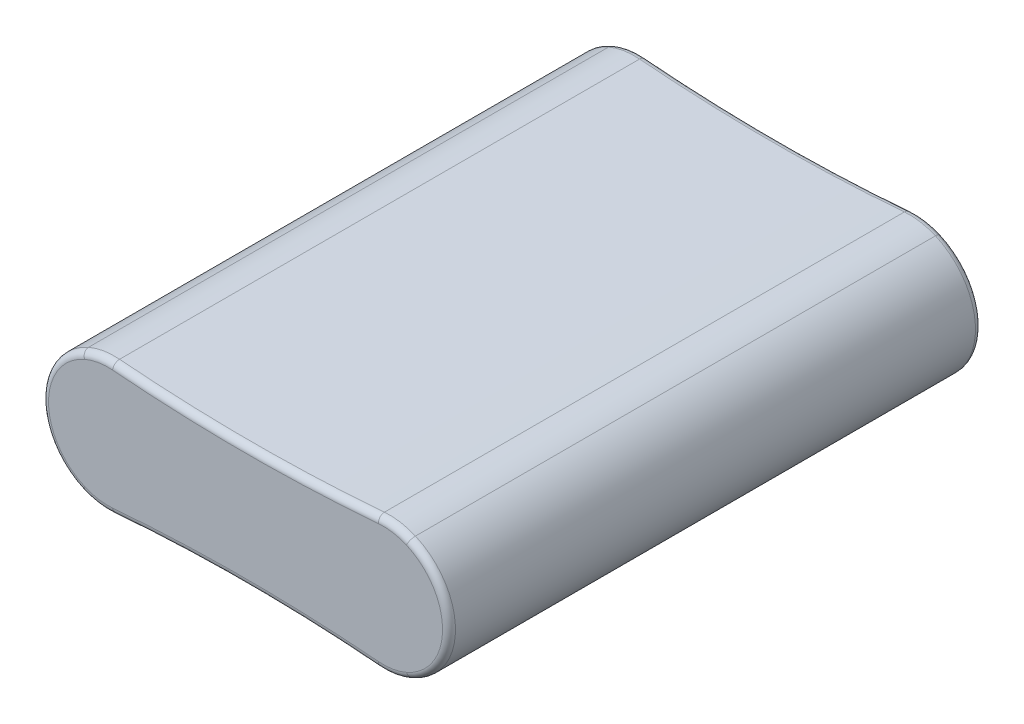
ISO-10303-21;
HEADER;
FILE_DESCRIPTION(('STEP AP214'),'2;1');
FILE_NAME('part.step','',(''),(''),'','','');
FILE_SCHEMA(('AUTOMOTIVE_DESIGN { 1 0 10303 214 1 1 1 1 }'));
ENDSEC;
DATA;
#1=APPLICATION_CONTEXT('core data for automotive mechanical design processes');
#2=APPLICATION_PROTOCOL_DEFINITION('international standard','automotive_design',2000,#1);
#3=PRODUCT_CONTEXT('',#1,'mechanical');
#4=PRODUCT('Part','Part','',(#3));
#5=PRODUCT_RELATED_PRODUCT_CATEGORY('part','',(#4));
#6=PRODUCT_DEFINITION_FORMATION('','',#4);
#7=PRODUCT_DEFINITION_CONTEXT('part definition',#1,'design');
#8=PRODUCT_DEFINITION('design','',#6,#7);
#9=PRODUCT_DEFINITION_SHAPE('','',#8);
#10=(LENGTH_UNIT() NAMED_UNIT(*) SI_UNIT(.MILLI.,.METRE.));
#11=(NAMED_UNIT(*) PLANE_ANGLE_UNIT() SI_UNIT($,.RADIAN.));
#12=(NAMED_UNIT(*) SI_UNIT($,.STERADIAN.) SOLID_ANGLE_UNIT());
#13=UNCERTAINTY_MEASURE_WITH_UNIT(LENGTH_MEASURE(1.E-05),#10,'distance_accuracy_value','');
#14=(GEOMETRIC_REPRESENTATION_CONTEXT(3) GLOBAL_UNCERTAINTY_ASSIGNED_CONTEXT((#13)) GLOBAL_UNIT_ASSIGNED_CONTEXT((#10,
#11,#12)) REPRESENTATION_CONTEXT('',''));
#15=CARTESIAN_POINT('',(0.,0.,0.));
#16=DIRECTION('',(0.,0.,1.));
#17=DIRECTION('',(1.,0.,0.));
#18=AXIS2_PLACEMENT_3D('',#15,#16,#17);
#19=CARTESIAN_POINT('',(-26.924,0.,52.3875));
#20=DIRECTION('',(0.,0.,-1.));
#21=DIRECTION('',(-1.,0.,0.));
#22=AXIS2_PLACEMENT_3D('',#19,#20,#21);
#23=CYLINDRICAL_SURFACE('',#22,13.081);
#24=DIRECTION('',(0.,0.,-1.));
#25=VECTOR('',#24,1.);
#26=CARTESIAN_POINT('',(-32.1420252730728,11.9951979245685,52.3875));
#27=LINE('',#26,#25);
#28=CARTESIAN_POINT('',(-32.1420252730728,11.9951979245685,51.1175));
#29=VERTEX_POINT('',#28);
#30=CARTESIAN_POINT('',(-32.1420252730728,11.9951979245685,-51.1175));
#31=VERTEX_POINT('',#30);
#32=EDGE_CURVE('E299',#29,#31,#27,.T.);
#33=ORIENTED_EDGE('',*,*,#32,.T.);
#34=CARTESIAN_POINT('',(-26.924,0.,-51.1175));
#35=DIRECTION('',(0.,0.,1.));
#36=DIRECTION('',(1.,0.,0.));
#37=AXIS2_PLACEMENT_3D('',#34,#35,#36);
#38=CIRCLE('',#37,13.081);
#39=CARTESIAN_POINT('',(-32.1420252720956,-11.9951979249936,-51.1175));
#40=VERTEX_POINT('',#39);
#41=EDGE_CURVE('E219',#31,#40,#38,.T.);
#42=ORIENTED_EDGE('',*,*,#41,.T.);
#43=DIRECTION('',(0.,0.,-1.));
#44=VECTOR('',#43,1.);
#45=CARTESIAN_POINT('',(-32.1420252720956,-11.9951979249936,52.3875));
#46=LINE('',#45,#44);
#47=CARTESIAN_POINT('',(-32.1420252720956,-11.9951979249936,51.1175));
#48=VERTEX_POINT('',#47);
#49=EDGE_CURVE('E291',#40,#48,#46,.F.);
#50=ORIENTED_EDGE('',*,*,#49,.T.);
#51=CARTESIAN_POINT('',(-26.924,0.,51.1175));
#52=DIRECTION('',(0.,0.,1.));
#53=DIRECTION('',(1.,0.,0.));
#54=AXIS2_PLACEMENT_3D('',#51,#52,#53);
#55=CIRCLE('',#54,13.081);
#56=EDGE_CURVE('E217',#48,#29,#55,.F.);
#57=ORIENTED_EDGE('',*,*,#56,.T.);
#58=EDGE_LOOP('',(#33,#42,#50,#57));
#59=FACE_BOUND('',#58,.T.);
#60=ADVANCED_FACE('F38',(#59),#23,.T.);
#61=CARTESIAN_POINT('',(-1.62940744230511E-13,-329.614388888888,52.3875));
#62=DIRECTION('',(0.,0.,-1.));
#63=DIRECTION('',(-1.,0.,0.));
#64=AXIS2_PLACEMENT_3D('',#61,#62,#63);
#65=CYLINDRICAL_SURFACE('',#64,317.676388888888);
#66=DIRECTION('',(0.,0.,-1.));
#67=VECTOR('',#66,1.);
#68=CARTESIAN_POINT('',(-26.0351534195383,-13.0066523379548,52.3875));
#69=LINE('',#68,#67);
#70=CARTESIAN_POINT('',(-26.0351534195383,-13.0066523379548,51.1175));
#71=VERTEX_POINT('',#70);
#72=CARTESIAN_POINT('',(-26.0351534195383,-13.0066523379548,-51.1175));
#73=VERTEX_POINT('',#72);
#74=EDGE_CURVE('E294',#71,#73,#69,.T.);
#75=ORIENTED_EDGE('',*,*,#74,.T.);
#76=CARTESIAN_POINT('',(-1.62940744230511E-13,-329.614388888888,-51.1175));
#77=DIRECTION('',(0.,0.,1.));
#78=DIRECTION('',(1.,0.,0.));
#79=AXIS2_PLACEMENT_3D('',#76,#77,#78);
#80=CIRCLE('',#79,317.676388888888);
#81=CARTESIAN_POINT('',(26.035153419572,-13.0066523379575,-51.1175));
#82=VERTEX_POINT('',#81);
#83=EDGE_CURVE('E211',#73,#82,#80,.F.);
#84=ORIENTED_EDGE('',*,*,#83,.T.);
#85=DIRECTION('',(0.,0.,-1.));
#86=VECTOR('',#85,1.);
#87=CARTESIAN_POINT('',(26.035153419572,-13.0066523379575,52.3875));
#88=LINE('',#87,#86);
#89=CARTESIAN_POINT('',(26.035153419572,-13.0066523379575,51.1175));
#90=VERTEX_POINT('',#89);
#91=EDGE_CURVE('E302',#82,#90,#88,.F.);
#92=ORIENTED_EDGE('',*,*,#91,.T.);
#93=CARTESIAN_POINT('',(-1.62940744230511E-13,-329.614388888888,51.1175));
#94=DIRECTION('',(0.,0.,1.));
#95=DIRECTION('',(1.,0.,0.));
#96=AXIS2_PLACEMENT_3D('',#93,#94,#95);
#97=CIRCLE('',#96,317.676388888888);
#98=EDGE_CURVE('E209',#90,#71,#97,.T.);
#99=ORIENTED_EDGE('',*,*,#98,.T.);
#100=EDGE_LOOP('',(#75,#84,#92,#99));
#101=FACE_BOUND('',#100,.T.);
#102=ADVANCED_FACE('F355',(#101),#65,.F.);
#103=CARTESIAN_POINT('',(26.924,0.,52.3875));
#104=DIRECTION('',(0.,0.,-1.));
#105=DIRECTION('',(-1.,0.,0.));
#106=AXIS2_PLACEMENT_3D('',#103,#104,#105);
#107=CYLINDRICAL_SURFACE('',#106,13.081);
#108=DIRECTION('',(0.,0.,-1.));
#109=VECTOR('',#108,1.);
#110=CARTESIAN_POINT('',(32.1420252730728,-11.9951979245685,52.3875));
#111=LINE('',#110,#109);
#112=CARTESIAN_POINT('',(32.1420252730728,-11.9951979245685,51.1175));
#113=VERTEX_POINT('',#112);
#114=CARTESIAN_POINT('',(32.1420252730728,-11.9951979245685,-51.1175));
#115=VERTEX_POINT('',#114);
#116=EDGE_CURVE('E308',#113,#115,#111,.T.);
#117=ORIENTED_EDGE('',*,*,#116,.T.);
#118=CARTESIAN_POINT('',(26.924,0.,-51.1175));
#119=DIRECTION('',(0.,0.,1.));
#120=DIRECTION('',(1.,0.,0.));
#121=AXIS2_PLACEMENT_3D('',#118,#119,#120);
#122=CIRCLE('',#121,13.081);
#123=CARTESIAN_POINT('',(32.1420252720957,11.9951979249936,-51.1175));
#124=VERTEX_POINT('',#123);
#125=EDGE_CURVE('E203',#115,#124,#122,.T.);
#126=ORIENTED_EDGE('',*,*,#125,.T.);
#127=DIRECTION('',(0.,0.,-1.));
#128=VECTOR('',#127,1.);
#129=CARTESIAN_POINT('',(32.1420252720957,11.9951979249936,52.3875));
#130=LINE('',#129,#128);
#131=CARTESIAN_POINT('',(32.1420252720957,11.9951979249936,51.1175));
#132=VERTEX_POINT('',#131);
#133=EDGE_CURVE('E254',#124,#132,#130,.F.);
#134=ORIENTED_EDGE('',*,*,#133,.T.);
#135=CARTESIAN_POINT('',(26.924,0.,51.1175));
#136=DIRECTION('',(0.,0.,1.));
#137=DIRECTION('',(1.,0.,0.));
#138=AXIS2_PLACEMENT_3D('',#135,#136,#137);
#139=CIRCLE('',#138,13.081);
#140=EDGE_CURVE('E201',#132,#113,#139,.F.);
#141=ORIENTED_EDGE('',*,*,#140,.T.);
#142=EDGE_LOOP('',(#117,#126,#134,#141));
#143=FACE_BOUND('',#142,.T.);
#144=ADVANCED_FACE('F314',(#143),#107,.T.);
#145=CARTESIAN_POINT('',(1.66410191182464E-13,329.614388888888,52.3875));
#146=DIRECTION('',(0.,0.,-1.));
#147=DIRECTION('',(-1.,0.,0.));
#148=AXIS2_PLACEMENT_3D('',#145,#146,#147);
#149=CYLINDRICAL_SURFACE('',#148,317.676388888888);
#150=DIRECTION('',(0.,0.,-1.));
#151=VECTOR('',#150,1.);
#152=CARTESIAN_POINT('',(26.0351534195383,13.0066523379548,52.3875));
#153=LINE('',#152,#151);
#154=CARTESIAN_POINT('',(26.0351534195383,13.0066523379548,51.1175));
#155=VERTEX_POINT('',#154);
#156=CARTESIAN_POINT('',(26.0351534195383,13.0066523379548,-51.1175));
#157=VERTEX_POINT('',#156);
#158=EDGE_CURVE('E180',#155,#157,#153,.T.);
#159=ORIENTED_EDGE('',*,*,#158,.T.);
#160=CARTESIAN_POINT('',(1.66410191182464E-13,329.614388888888,-51.1175));
#161=DIRECTION('',(0.,0.,1.));
#162=DIRECTION('',(1.,0.,0.));
#163=AXIS2_PLACEMENT_3D('',#160,#161,#162);
#164=CIRCLE('',#163,317.676388888888);
#165=CARTESIAN_POINT('',(-26.035153419572,13.0066523379575,-51.1175));
#166=VERTEX_POINT('',#165);
#167=EDGE_CURVE('E11',#157,#166,#164,.F.);
#168=ORIENTED_EDGE('',*,*,#167,.T.);
#169=DIRECTION('',(0.,0.,-1.));
#170=VECTOR('',#169,1.);
#171=CARTESIAN_POINT('',(-26.035153419572,13.0066523379575,52.3875));
#172=LINE('',#171,#170);
#173=CARTESIAN_POINT('',(-26.035153419572,13.0066523379575,51.1175));
#174=VERTEX_POINT('',#173);
#175=EDGE_CURVE('E177',#166,#174,#172,.F.);
#176=ORIENTED_EDGE('',*,*,#175,.T.);
#177=CARTESIAN_POINT('',(1.66410191182464E-13,329.614388888888,51.1175));
#178=DIRECTION('',(0.,0.,1.));
#179=DIRECTION('',(1.,0.,0.));
#180=AXIS2_PLACEMENT_3D('',#177,#178,#179);
#181=CIRCLE('',#180,317.676388888888);
#182=EDGE_CURVE('E47',#174,#155,#181,.T.);
#183=ORIENTED_EDGE('',*,*,#182,.T.);
#184=EDGE_LOOP('',(#159,#168,#176,#183));
#185=FACE_BOUND('',#184,.T.);
#186=ADVANCED_FACE('F516',(#185),#149,.F.);
#187=CARTESIAN_POINT('',(-13.4620000000001,-164.807194444444,52.3875));
#188=DIRECTION('',(0.,0.,1.));
#189=DIRECTION('',(1.,0.,0.));
#190=AXIS2_PLACEMENT_3D('',#187,#188,#189);
#191=PLANE('',#190);
#192=CARTESIAN_POINT('',(26.924,0.,52.3875));
#193=DIRECTION('',(0.,0.,1.));
#194=DIRECTION('',(1.,0.,0.));
#195=AXIS2_PLACEMENT_3D('',#192,#193,#194);
#196=CIRCLE('',#195,11.811);
#197=CARTESIAN_POINT('',(31.6354208776288,-10.8306156017949,52.3875));
#198=VERTEX_POINT('',#197);
#199=CARTESIAN_POINT('',(31.6354208767466,10.8306156021787,52.3875));
#200=VERTEX_POINT('',#199);
#201=EDGE_CURVE('E55',#198,#200,#196,.T.);
#202=ORIENTED_EDGE('',*,*,#201,.T.);
#203=CARTESIAN_POINT('',(27.0759813185981,0.349374696829219,52.3875));
#204=DIRECTION('',(0.,0.,1.));
#205=DIRECTION('',(1.,0.,0.));
#206=AXIS2_PLACEMENT_3D('',#203,#204,#205);
#207=CIRCLE('',#206,11.43);
#208=CARTESIAN_POINT('',(26.1392362094442,11.7409245738423,52.3875));
#209=VERTEX_POINT('',#208);
#210=EDGE_CURVE('E236',#200,#209,#207,.T.);
#211=ORIENTED_EDGE('',*,*,#210,.T.);
#212=CARTESIAN_POINT('',(1.66410191182464E-13,329.614388888888,52.3875));
#213=DIRECTION('',(0.,0.,1.));
#214=DIRECTION('',(1.,0.,0.));
#215=AXIS2_PLACEMENT_3D('',#212,#213,#214);
#216=CIRCLE('',#215,318.946388888888);
#217=CARTESIAN_POINT('',(-26.1392362094781,11.740924573845,52.3875));
#218=VERTEX_POINT('',#217);
#219=EDGE_CURVE('E224',#209,#218,#216,.F.);
#220=ORIENTED_EDGE('',*,*,#219,.T.);
#221=CARTESIAN_POINT('',(-27.0759813186332,0.349374696832078,52.3875));
#222=DIRECTION('',(0.,0.,1.));
#223=DIRECTION('',(1.,0.,0.));
#224=AXIS2_PLACEMENT_3D('',#221,#222,#223);
#225=CIRCLE('',#224,11.43);
#226=CARTESIAN_POINT('',(-31.6354208776288,10.8306156017949,52.3875));
#227=VERTEX_POINT('',#226);
#228=EDGE_CURVE('E226',#218,#227,#225,.T.);
#229=ORIENTED_EDGE('',*,*,#228,.T.);
#230=CARTESIAN_POINT('',(-26.924,0.,52.3875));
#231=DIRECTION('',(0.,0.,1.));
#232=DIRECTION('',(1.,0.,0.));
#233=AXIS2_PLACEMENT_3D('',#230,#231,#232);
#234=CIRCLE('',#233,11.811);
#235=CARTESIAN_POINT('',(-31.6354208767465,-10.8306156021787,52.3875));
#236=VERTEX_POINT('',#235);
#237=EDGE_CURVE('E228',#227,#236,#234,.T.);
#238=ORIENTED_EDGE('',*,*,#237,.T.);
#239=CARTESIAN_POINT('',(-27.0759813185981,-0.349374696829219,52.3875));
#240=DIRECTION('',(0.,0.,1.));
#241=DIRECTION('',(1.,0.,0.));
#242=AXIS2_PLACEMENT_3D('',#239,#240,#241);
#243=CIRCLE('',#242,11.43);
#244=CARTESIAN_POINT('',(-26.1392362094442,-11.7409245738423,52.3875));
#245=VERTEX_POINT('',#244);
#246=EDGE_CURVE('E230',#236,#245,#243,.T.);
#247=ORIENTED_EDGE('',*,*,#246,.T.);
#248=CARTESIAN_POINT('',(-1.62940744230511E-13,-329.614388888888,52.3875));
#249=DIRECTION('',(0.,0.,1.));
#250=DIRECTION('',(1.,0.,0.));
#251=AXIS2_PLACEMENT_3D('',#248,#249,#250);
#252=CIRCLE('',#251,318.946388888888);
#253=CARTESIAN_POINT('',(26.1392362094781,-11.740924573845,52.3875));
#254=VERTEX_POINT('',#253);
#255=EDGE_CURVE('E232',#245,#254,#252,.F.);
#256=ORIENTED_EDGE('',*,*,#255,.T.);
#257=CARTESIAN_POINT('',(27.0759813186332,-0.349374696832078,52.3875));
#258=DIRECTION('',(0.,0.,1.));
#259=DIRECTION('',(1.,0.,0.));
#260=AXIS2_PLACEMENT_3D('',#257,#258,#259);
#261=CIRCLE('',#260,11.43);
#262=EDGE_CURVE('E60',#254,#198,#261,.T.);
#263=ORIENTED_EDGE('',*,*,#262,.T.);
#264=EDGE_LOOP('',(#202,#211,#220,#229,#238,#247,#256,#263));
#265=FACE_BOUND('',#264,.T.);
#266=ADVANCED_FACE('F509',(#265),#191,.T.);
#267=CARTESIAN_POINT('',(-13.4620000000001,-164.807194444444,-52.3875));
#268=DIRECTION('',(0.,0.,1.));
#269=DIRECTION('',(1.,0.,0.));
#270=AXIS2_PLACEMENT_3D('',#267,#268,#269);
#271=PLANE('',#270);
#272=CARTESIAN_POINT('',(1.66410191182464E-13,329.614388888888,-52.3875));
#273=DIRECTION('',(0.,0.,1.));
#274=DIRECTION('',(1.,0.,0.));
#275=AXIS2_PLACEMENT_3D('',#272,#273,#274);
#276=CIRCLE('',#275,318.946388888888);
#277=CARTESIAN_POINT('',(-26.1392362094781,11.740924573845,-52.3875));
#278=VERTEX_POINT('',#277);
#279=CARTESIAN_POINT('',(26.1392362094442,11.7409245738423,-52.3875));
#280=VERTEX_POINT('',#279);
#281=EDGE_CURVE('E156',#278,#280,#276,.T.);
#282=ORIENTED_EDGE('',*,*,#281,.T.);
#283=CARTESIAN_POINT('',(27.0759813185981,0.349374696829219,-52.3875));
#284=DIRECTION('',(0.,0.,1.));
#285=DIRECTION('',(1.,0.,0.));
#286=AXIS2_PLACEMENT_3D('',#283,#284,#285);
#287=CIRCLE('',#286,11.43);
#288=CARTESIAN_POINT('',(31.6354208767466,10.8306156021787,-52.3875));
#289=VERTEX_POINT('',#288);
#290=EDGE_CURVE('E193',#280,#289,#287,.F.);
#291=ORIENTED_EDGE('',*,*,#290,.T.);
#292=CARTESIAN_POINT('',(26.924,0.,-52.3875));
#293=DIRECTION('',(0.,0.,1.));
#294=DIRECTION('',(1.,0.,0.));
#295=AXIS2_PLACEMENT_3D('',#292,#293,#294);
#296=CIRCLE('',#295,11.811);
#297=CARTESIAN_POINT('',(31.6354208776288,-10.8306156017949,-52.3875));
#298=VERTEX_POINT('',#297);
#299=EDGE_CURVE('E191',#289,#298,#296,.F.);
#300=ORIENTED_EDGE('',*,*,#299,.T.);
#301=CARTESIAN_POINT('',(27.0759813186332,-0.349374696832078,-52.3875));
#302=DIRECTION('',(0.,0.,1.));
#303=DIRECTION('',(1.,0.,0.));
#304=AXIS2_PLACEMENT_3D('',#301,#302,#303);
#305=CIRCLE('',#304,11.43);
#306=CARTESIAN_POINT('',(26.1392362094781,-11.740924573845,-52.3875));
#307=VERTEX_POINT('',#306);
#308=EDGE_CURVE('E189',#298,#307,#305,.F.);
#309=ORIENTED_EDGE('',*,*,#308,.T.);
#310=CARTESIAN_POINT('',(-1.62940744230511E-13,-329.614388888888,-52.3875));
#311=DIRECTION('',(0.,0.,1.));
#312=DIRECTION('',(1.,0.,0.));
#313=AXIS2_PLACEMENT_3D('',#310,#311,#312);
#314=CIRCLE('',#313,318.946388888888);
#315=CARTESIAN_POINT('',(-26.1392362094442,-11.7409245738423,-52.3875));
#316=VERTEX_POINT('',#315);
#317=EDGE_CURVE('E187',#307,#316,#314,.T.);
#318=ORIENTED_EDGE('',*,*,#317,.T.);
#319=CARTESIAN_POINT('',(-27.0759813185981,-0.349374696829219,-52.3875));
#320=DIRECTION('',(0.,0.,1.));
#321=DIRECTION('',(1.,0.,0.));
#322=AXIS2_PLACEMENT_3D('',#319,#320,#321);
#323=CIRCLE('',#322,11.43);
#324=CARTESIAN_POINT('',(-31.6354208767465,-10.8306156021787,-52.3875));
#325=VERTEX_POINT('',#324);
#326=EDGE_CURVE('E185',#316,#325,#323,.F.);
#327=ORIENTED_EDGE('',*,*,#326,.T.);
#328=CARTESIAN_POINT('',(-26.924,0.,-52.3875));
#329=DIRECTION('',(0.,0.,1.));
#330=DIRECTION('',(1.,0.,0.));
#331=AXIS2_PLACEMENT_3D('',#328,#329,#330);
#332=CIRCLE('',#331,11.811);
#333=CARTESIAN_POINT('',(-31.6354208776288,10.8306156017949,-52.3875));
#334=VERTEX_POINT('',#333);
#335=EDGE_CURVE('E159',#325,#334,#332,.F.);
#336=ORIENTED_EDGE('',*,*,#335,.T.);
#337=CARTESIAN_POINT('',(-27.0759813186332,0.349374696832078,-52.3875));
#338=DIRECTION('',(0.,0.,1.));
#339=DIRECTION('',(1.,0.,0.));
#340=AXIS2_PLACEMENT_3D('',#337,#338,#339);
#341=CIRCLE('',#340,11.43);
#342=EDGE_CURVE('E151',#334,#278,#341,.F.);
#343=ORIENTED_EDGE('',*,*,#342,.T.);
#344=EDGE_LOOP('',(#282,#291,#300,#309,#318,#327,#336,#343));
#345=FACE_BOUND('',#344,.T.);
#346=ADVANCED_FACE('F153',(#345),#271,.F.);
#347=CARTESIAN_POINT('',(27.0759813186332,-0.349374696832078,52.3875));
#348=DIRECTION('',(0.,0.,1.));
#349=DIRECTION('',(1.,0.,0.));
#350=AXIS2_PLACEMENT_3D('',#347,#348,#349);
#351=CYLINDRICAL_SURFACE('',#350,12.7);
#352=ORIENTED_EDGE('',*,*,#91,.F.);
#353=CARTESIAN_POINT('',(27.0759813186332,-0.349374696832078,-51.1175));
#354=DIRECTION('',(0.,0.,1.));
#355=DIRECTION('',(1.,0.,0.));
#356=AXIS2_PLACEMENT_3D('',#353,#354,#355);
#357=CIRCLE('',#356,12.7);
#358=EDGE_CURVE('E207',#82,#115,#357,.T.);
#359=ORIENTED_EDGE('',*,*,#358,.T.);
#360=ORIENTED_EDGE('',*,*,#116,.F.);
#361=CARTESIAN_POINT('',(27.0759813186332,-0.349374696832078,51.1175));
#362=DIRECTION('',(0.,0.,1.));
#363=DIRECTION('',(1.,0.,0.));
#364=AXIS2_PLACEMENT_3D('',#361,#362,#363);
#365=CIRCLE('',#364,12.7);
#366=EDGE_CURVE('E205',#113,#90,#365,.F.);
#367=ORIENTED_EDGE('',*,*,#366,.T.);
#368=EDGE_LOOP('',(#352,#359,#360,#367));
#369=FACE_BOUND('',#368,.T.);
#370=ADVANCED_FACE('F364',(#369),#351,.T.);
#371=CARTESIAN_POINT('',(-27.0759813185981,-0.349374696829219,52.3875));
#372=DIRECTION('',(0.,0.,1.));
#373=DIRECTION('',(1.,0.,0.));
#374=AXIS2_PLACEMENT_3D('',#371,#372,#373);
#375=CYLINDRICAL_SURFACE('',#374,12.7);
#376=ORIENTED_EDGE('',*,*,#49,.F.);
#377=CARTESIAN_POINT('',(-27.0759813185981,-0.349374696829219,-51.1175));
#378=DIRECTION('',(0.,0.,1.));
#379=DIRECTION('',(1.,0.,0.));
#380=AXIS2_PLACEMENT_3D('',#377,#378,#379);
#381=CIRCLE('',#380,12.7);
#382=EDGE_CURVE('E215',#40,#73,#381,.T.);
#383=ORIENTED_EDGE('',*,*,#382,.T.);
#384=ORIENTED_EDGE('',*,*,#74,.F.);
#385=CARTESIAN_POINT('',(-27.0759813185981,-0.349374696829219,51.1175));
#386=DIRECTION('',(0.,0.,1.));
#387=DIRECTION('',(1.,0.,0.));
#388=AXIS2_PLACEMENT_3D('',#385,#386,#387);
#389=CIRCLE('',#388,12.7);
#390=EDGE_CURVE('E213',#71,#48,#389,.F.);
#391=ORIENTED_EDGE('',*,*,#390,.T.);
#392=EDGE_LOOP('',(#376,#383,#384,#391));
#393=FACE_BOUND('',#392,.T.);
#394=ADVANCED_FACE('F290',(#393),#375,.T.);
#395=CARTESIAN_POINT('',(-27.0759813186332,0.349374696832078,52.3875));
#396=DIRECTION('',(0.,0.,1.));
#397=DIRECTION('',(1.,0.,0.));
#398=AXIS2_PLACEMENT_3D('',#395,#396,#397);
#399=CYLINDRICAL_SURFACE('',#398,12.7);
#400=ORIENTED_EDGE('',*,*,#175,.F.);
#401=CARTESIAN_POINT('',(-27.0759813186332,0.349374696832078,-51.1175));
#402=DIRECTION('',(0.,0.,1.));
#403=DIRECTION('',(1.,0.,0.));
#404=AXIS2_PLACEMENT_3D('',#401,#402,#403);
#405=CIRCLE('',#404,12.7);
#406=EDGE_CURVE('E168',#166,#31,#405,.T.);
#407=ORIENTED_EDGE('',*,*,#406,.T.);
#408=ORIENTED_EDGE('',*,*,#32,.F.);
#409=CARTESIAN_POINT('',(-27.0759813186332,0.349374696832078,51.1175));
#410=DIRECTION('',(0.,0.,1.));
#411=DIRECTION('',(1.,0.,0.));
#412=AXIS2_PLACEMENT_3D('',#409,#410,#411);
#413=CIRCLE('',#412,12.7);
#414=EDGE_CURVE('E221',#29,#174,#413,.F.);
#415=ORIENTED_EDGE('',*,*,#414,.T.);
#416=EDGE_LOOP('',(#400,#407,#408,#415));
#417=FACE_BOUND('',#416,.T.);
#418=ADVANCED_FACE('F370',(#417),#399,.T.);
#419=CARTESIAN_POINT('',(27.0759813185981,0.349374696829219,52.3875));
#420=DIRECTION('',(0.,0.,1.));
#421=DIRECTION('',(1.,0.,0.));
#422=AXIS2_PLACEMENT_3D('',#419,#420,#421);
#423=CYLINDRICAL_SURFACE('',#422,12.7);
#424=ORIENTED_EDGE('',*,*,#133,.F.);
#425=CARTESIAN_POINT('',(27.0759813185981,0.349374696829219,-51.1175));
#426=DIRECTION('',(0.,0.,1.));
#427=DIRECTION('',(1.,0.,0.));
#428=AXIS2_PLACEMENT_3D('',#425,#426,#427);
#429=CIRCLE('',#428,12.7);
#430=EDGE_CURVE('E198',#124,#157,#429,.T.);
#431=ORIENTED_EDGE('',*,*,#430,.T.);
#432=ORIENTED_EDGE('',*,*,#158,.F.);
#433=CARTESIAN_POINT('',(27.0759813185981,0.349374696829219,51.1175));
#434=DIRECTION('',(0.,0.,1.));
#435=DIRECTION('',(1.,0.,0.));
#436=AXIS2_PLACEMENT_3D('',#433,#434,#435);
#437=CIRCLE('',#436,12.7);
#438=EDGE_CURVE('E195',#155,#132,#437,.F.);
#439=ORIENTED_EDGE('',*,*,#438,.T.);
#440=EDGE_LOOP('',(#424,#431,#432,#439));
#441=FACE_BOUND('',#440,.T.);
#442=ADVANCED_FACE('F320',(#441),#423,.T.);
#443=CARTESIAN_POINT('',(-27.0759813185981,-0.349374696829219,-51.1175));
#444=DIRECTION('',(0.,0.,1.));
#445=DIRECTION('',(1.,0.,0.));
#446=AXIS2_PLACEMENT_3D('',#443,#444,#445);
#447=TOROIDAL_SURFACE('',#446,11.43,1.27);
#448=CARTESIAN_POINT('',(-26.1392362094442,-11.7409245738423,-51.1175));
#449=DIRECTION('',(0.996636034734301,0.0819549526818767,0.));
#450=DIRECTION('',(-0.0819549526818757,0.996636034734301,0.));
#451=AXIS2_PLACEMENT_3D('',#448,#449,#450);
#452=CIRCLE('',#451,1.27);
#453=EDGE_CURVE('E248',#73,#316,#452,.T.);
#454=ORIENTED_EDGE('',*,*,#453,.F.);
#455=ORIENTED_EDGE('',*,*,#382,.F.);
#456=CARTESIAN_POINT('',(-31.6354208767399,-10.8306156021634,-51.1175));
#457=DIRECTION('',(-0.916993954972374,0.398901098700069,0.));
#458=DIRECTION('',(-0.39890109870007,-0.916993954972375,0.));
#459=AXIS2_PLACEMENT_3D('',#456,#457,#458);
#460=CIRCLE('',#459,1.27);
#461=EDGE_CURVE('E251',#325,#40,#460,.T.);
#462=ORIENTED_EDGE('',*,*,#461,.F.);
#463=ORIENTED_EDGE('',*,*,#326,.F.);
#464=EDGE_LOOP('',(#454,#455,#462,#463));
#465=FACE_BOUND('',#464,.T.);
#466=ADVANCED_FACE('F343',(#465),#447,.T.);
#467=CARTESIAN_POINT('',(-26.924,0.,-51.1175));
#468=DIRECTION('',(0.,0.,1.));
#469=DIRECTION('',(1.,0.,0.));
#470=AXIS2_PLACEMENT_3D('',#467,#468,#469);
#471=TOROIDAL_SURFACE('',#470,11.811,1.27);
#472=ORIENTED_EDGE('',*,*,#461,.T.);
#473=ORIENTED_EDGE('',*,*,#41,.F.);
#474=CARTESIAN_POINT('',(-31.6354208776288,10.8306156017949,-51.1175));
#475=DIRECTION('',(0.91699395493988,0.39890109877477,0.));
#476=DIRECTION('',(-0.398901098774769,0.916993954939879,0.));
#477=AXIS2_PLACEMENT_3D('',#474,#475,#476);
#478=CIRCLE('',#477,1.27);
#479=EDGE_CURVE('E246',#334,#31,#478,.T.);
#480=ORIENTED_EDGE('',*,*,#479,.F.);
#481=ORIENTED_EDGE('',*,*,#335,.F.);
#482=EDGE_LOOP('',(#472,#473,#480,#481));
#483=FACE_BOUND('',#482,.T.);
#484=ADVANCED_FACE('F345',(#483),#471,.T.);
#485=CARTESIAN_POINT('',(-1.62940744230511E-13,-329.614388888888,-51.1175));
#486=DIRECTION('',(0.,0.,1.));
#487=DIRECTION('',(1.,0.,0.));
#488=AXIS2_PLACEMENT_3D('',#485,#486,#487);
#489=TOROIDAL_SURFACE('',#488,318.946388888888,1.27);
#490=ORIENTED_EDGE('',*,*,#453,.T.);
#491=ORIENTED_EDGE('',*,*,#317,.F.);
#492=CARTESIAN_POINT('',(26.1392362094781,-11.740924573845,-51.1175));
#493=DIRECTION('',(0.996636034734293,-0.0819549526819822,0.));
#494=DIRECTION('',(0.0819549526819832,0.996636034734293,0.));
#495=AXIS2_PLACEMENT_3D('',#492,#493,#494);
#496=CIRCLE('',#495,1.27);
#497=EDGE_CURVE('E171',#82,#307,#496,.T.);
#498=ORIENTED_EDGE('',*,*,#497,.F.);
#499=ORIENTED_EDGE('',*,*,#83,.F.);
#500=EDGE_LOOP('',(#490,#491,#498,#499));
#501=FACE_BOUND('',#500,.T.);
#502=ADVANCED_FACE('F338',(#501),#489,.T.);
#503=CARTESIAN_POINT('',(-27.0759813186332,0.349374696832078,-51.1175));
#504=DIRECTION('',(0.,0.,1.));
#505=DIRECTION('',(1.,0.,0.));
#506=AXIS2_PLACEMENT_3D('',#503,#504,#505);
#507=TOROIDAL_SURFACE('',#506,11.43,1.27);
#508=ORIENTED_EDGE('',*,*,#479,.T.);
#509=ORIENTED_EDGE('',*,*,#406,.F.);
#510=CARTESIAN_POINT('',(-26.1392362094781,11.740924573845,-51.1175));
#511=DIRECTION('',(0.996636034734293,-0.0819549526819822,0.));
#512=DIRECTION('',(0.0819549526819832,0.996636034734293,0.));
#513=AXIS2_PLACEMENT_3D('',#510,#511,#512);
#514=CIRCLE('',#513,1.27);
#515=EDGE_CURVE('E166',#278,#166,#514,.T.);
#516=ORIENTED_EDGE('',*,*,#515,.F.);
#517=ORIENTED_EDGE('',*,*,#342,.F.);
#518=EDGE_LOOP('',(#508,#509,#516,#517));
#519=FACE_BOUND('',#518,.T.);
#520=ADVANCED_FACE('F167',(#519),#507,.T.);
#521=CARTESIAN_POINT('',(27.0759813186332,-0.349374696832078,-51.1175));
#522=DIRECTION('',(0.,0.,1.));
#523=DIRECTION('',(1.,0.,0.));
#524=AXIS2_PLACEMENT_3D('',#521,#522,#523);
#525=TOROIDAL_SURFACE('',#524,11.43,1.27);
#526=ORIENTED_EDGE('',*,*,#497,.T.);
#527=ORIENTED_EDGE('',*,*,#308,.F.);
#528=CARTESIAN_POINT('',(31.6354208776288,-10.8306156017949,-51.1175));
#529=DIRECTION('',(0.91699395493988,0.39890109877477,0.));
#530=DIRECTION('',(-0.398901098774769,0.916993954939879,0.));
#531=AXIS2_PLACEMENT_3D('',#528,#529,#530);
#532=CIRCLE('',#531,1.27);
#533=EDGE_CURVE('E172',#115,#298,#532,.T.);
#534=ORIENTED_EDGE('',*,*,#533,.F.);
#535=ORIENTED_EDGE('',*,*,#358,.F.);
#536=EDGE_LOOP('',(#526,#527,#534,#535));
#537=FACE_BOUND('',#536,.T.);
#538=ADVANCED_FACE('F333',(#537),#525,.T.);
#539=CARTESIAN_POINT('',(1.66410191182464E-13,329.614388888888,-51.1175));
#540=DIRECTION('',(0.,0.,1.));
#541=DIRECTION('',(1.,0.,0.));
#542=AXIS2_PLACEMENT_3D('',#539,#540,#541);
#543=TOROIDAL_SURFACE('',#542,318.946388888888,1.27);
#544=ORIENTED_EDGE('',*,*,#515,.T.);
#545=ORIENTED_EDGE('',*,*,#167,.F.);
#546=CARTESIAN_POINT('',(26.1392362094442,11.7409245738423,-51.1175));
#547=DIRECTION('',(0.996636034734301,0.0819549526818766,0.));
#548=DIRECTION('',(-0.0819549526818756,0.996636034734301,0.));
#549=AXIS2_PLACEMENT_3D('',#546,#547,#548);
#550=CIRCLE('',#549,1.27);
#551=EDGE_CURVE('E175',#280,#157,#550,.T.);
#552=ORIENTED_EDGE('',*,*,#551,.F.);
#553=ORIENTED_EDGE('',*,*,#281,.F.);
#554=EDGE_LOOP('',(#544,#545,#552,#553));
#555=FACE_BOUND('',#554,.T.);
#556=ADVANCED_FACE('F174',(#555),#543,.T.);
#557=CARTESIAN_POINT('',(26.924,0.,-51.1175));
#558=DIRECTION('',(0.,0.,1.));
#559=DIRECTION('',(1.,0.,0.));
#560=AXIS2_PLACEMENT_3D('',#557,#558,#559);
#561=TOROIDAL_SURFACE('',#560,11.811,1.27);
#562=ORIENTED_EDGE('',*,*,#533,.T.);
#563=ORIENTED_EDGE('',*,*,#299,.F.);
#564=CARTESIAN_POINT('',(31.6354208767466,10.8306156021787,-51.1175));
#565=DIRECTION('',(-0.91699395497237,0.398901098700079,0.));
#566=DIRECTION('',(-0.39890109870008,-0.916993954972371,0.));
#567=AXIS2_PLACEMENT_3D('',#564,#565,#566);
#568=CIRCLE('',#567,1.27);
#569=EDGE_CURVE('E239',#124,#289,#568,.T.);
#570=ORIENTED_EDGE('',*,*,#569,.F.);
#571=ORIENTED_EDGE('',*,*,#125,.F.);
#572=EDGE_LOOP('',(#562,#563,#570,#571));
#573=FACE_BOUND('',#572,.T.);
#574=ADVANCED_FACE('F328',(#573),#561,.T.);
#575=CARTESIAN_POINT('',(27.0759813185981,0.349374696829219,-51.1175));
#576=DIRECTION('',(0.,0.,1.));
#577=DIRECTION('',(1.,0.,0.));
#578=AXIS2_PLACEMENT_3D('',#575,#576,#577);
#579=TOROIDAL_SURFACE('',#578,11.43,1.27);
#580=ORIENTED_EDGE('',*,*,#551,.T.);
#581=ORIENTED_EDGE('',*,*,#430,.F.);
#582=ORIENTED_EDGE('',*,*,#569,.T.);
#583=ORIENTED_EDGE('',*,*,#290,.F.);
#584=EDGE_LOOP('',(#580,#581,#582,#583));
#585=FACE_BOUND('',#584,.T.);
#586=ADVANCED_FACE('F325',(#585),#579,.T.);
#587=CARTESIAN_POINT('',(-27.0759813185981,-0.349374696829219,51.1175));
#588=DIRECTION('',(0.,0.,1.));
#589=DIRECTION('',(1.,0.,0.));
#590=AXIS2_PLACEMENT_3D('',#587,#588,#589);
#591=TOROIDAL_SURFACE('',#590,11.43,1.27);
#592=CARTESIAN_POINT('',(-31.6354208767399,-10.8306156021634,51.1175));
#593=DIRECTION('',(-0.916993954972372,0.398901098700074,0.));
#594=DIRECTION('',(-0.398901098700075,-0.916993954972373,0.));
#595=AXIS2_PLACEMENT_3D('',#592,#593,#594);
#596=CIRCLE('',#595,1.27);
#597=EDGE_CURVE('E270',#48,#236,#596,.T.);
#598=ORIENTED_EDGE('',*,*,#597,.F.);
#599=ORIENTED_EDGE('',*,*,#390,.F.);
#600=CARTESIAN_POINT('',(-26.1392362094442,-11.7409245738423,51.1175));
#601=DIRECTION('',(0.996636034734301,0.0819549526818767,0.));
#602=DIRECTION('',(-0.0819549526818757,0.996636034734301,0.));
#603=AXIS2_PLACEMENT_3D('',#600,#601,#602);
#604=CIRCLE('',#603,1.27);
#605=EDGE_CURVE('E42',#245,#71,#604,.T.);
#606=ORIENTED_EDGE('',*,*,#605,.F.);
#607=ORIENTED_EDGE('',*,*,#246,.F.);
#608=EDGE_LOOP('',(#598,#599,#606,#607));
#609=FACE_BOUND('',#608,.T.);
#610=ADVANCED_FACE('F40',(#609),#591,.T.);
#611=CARTESIAN_POINT('',(-1.62940744230511E-13,-329.614388888888,51.1175));
#612=DIRECTION('',(0.,0.,1.));
#613=DIRECTION('',(1.,0.,0.));
#614=AXIS2_PLACEMENT_3D('',#611,#612,#613);
#615=TOROIDAL_SURFACE('',#614,318.946388888888,1.27);
#616=ORIENTED_EDGE('',*,*,#605,.T.);
#617=ORIENTED_EDGE('',*,*,#98,.F.);
#618=CARTESIAN_POINT('',(26.1392362094781,-11.740924573845,51.1175));
#619=DIRECTION('',(0.996636034734293,-0.0819549526819822,0.));
#620=DIRECTION('',(0.0819549526819832,0.996636034734293,0.));
#621=AXIS2_PLACEMENT_3D('',#618,#619,#620);
#622=CIRCLE('',#621,1.27);
#623=EDGE_CURVE('E268',#254,#90,#622,.T.);
#624=ORIENTED_EDGE('',*,*,#623,.F.);
#625=ORIENTED_EDGE('',*,*,#255,.F.);
#626=EDGE_LOOP('',(#616,#617,#624,#625));
#627=FACE_BOUND('',#626,.T.);
#628=ADVANCED_FACE('F281',(#627),#615,.T.);
#629=CARTESIAN_POINT('',(-26.924,0.,51.1175));
#630=DIRECTION('',(0.,0.,1.));
#631=DIRECTION('',(1.,0.,0.));
#632=AXIS2_PLACEMENT_3D('',#629,#630,#631);
#633=TOROIDAL_SURFACE('',#632,11.811,1.27);
#634=ORIENTED_EDGE('',*,*,#597,.T.);
#635=ORIENTED_EDGE('',*,*,#237,.F.);
#636=CARTESIAN_POINT('',(-31.6354208776288,10.8306156017949,51.1175));
#637=DIRECTION('',(0.91699395493988,0.39890109877477,0.));
#638=DIRECTION('',(-0.398901098774769,0.916993954939879,0.));
#639=AXIS2_PLACEMENT_3D('',#636,#637,#638);
#640=CIRCLE('',#639,1.27);
#641=EDGE_CURVE('E265',#29,#227,#640,.T.);
#642=ORIENTED_EDGE('',*,*,#641,.F.);
#643=ORIENTED_EDGE('',*,*,#56,.F.);
#644=EDGE_LOOP('',(#634,#635,#642,#643));
#645=FACE_BOUND('',#644,.T.);
#646=ADVANCED_FACE('F420',(#645),#633,.T.);
#647=CARTESIAN_POINT('',(27.0759813186332,-0.349374696832078,51.1175));
#648=DIRECTION('',(0.,0.,1.));
#649=DIRECTION('',(1.,0.,0.));
#650=AXIS2_PLACEMENT_3D('',#647,#648,#649);
#651=TOROIDAL_SURFACE('',#650,11.43,1.27);
#652=ORIENTED_EDGE('',*,*,#623,.T.);
#653=ORIENTED_EDGE('',*,*,#366,.F.);
#654=CARTESIAN_POINT('',(31.6354208776288,-10.8306156017949,51.1175));
#655=DIRECTION('',(0.91699395493988,0.398901098774769,0.));
#656=DIRECTION('',(-0.398901098774768,0.916993954939879,0.));
#657=AXIS2_PLACEMENT_3D('',#654,#655,#656);
#658=CIRCLE('',#657,1.27);
#659=EDGE_CURVE('E262',#198,#113,#658,.T.);
#660=ORIENTED_EDGE('',*,*,#659,.F.);
#661=ORIENTED_EDGE('',*,*,#262,.F.);
#662=EDGE_LOOP('',(#652,#653,#660,#661));
#663=FACE_BOUND('',#662,.T.);
#664=ADVANCED_FACE('F426',(#663),#651,.T.);
#665=CARTESIAN_POINT('',(-27.0759813186332,0.349374696832078,51.1175));
#666=DIRECTION('',(0.,0.,1.));
#667=DIRECTION('',(1.,0.,0.));
#668=AXIS2_PLACEMENT_3D('',#665,#666,#667);
#669=TOROIDAL_SURFACE('',#668,11.43,1.27);
#670=ORIENTED_EDGE('',*,*,#641,.T.);
#671=ORIENTED_EDGE('',*,*,#228,.F.);
#672=CARTESIAN_POINT('',(-26.1392362094781,11.740924573845,51.1175));
#673=DIRECTION('',(0.996636034734293,-0.0819549526819822,0.));
#674=DIRECTION('',(0.0819549526819832,0.996636034734293,0.));
#675=AXIS2_PLACEMENT_3D('',#672,#673,#674);
#676=CIRCLE('',#675,1.27);
#677=EDGE_CURVE('E259',#174,#218,#676,.T.);
#678=ORIENTED_EDGE('',*,*,#677,.F.);
#679=ORIENTED_EDGE('',*,*,#414,.F.);
#680=EDGE_LOOP('',(#670,#671,#678,#679));
#681=FACE_BOUND('',#680,.T.);
#682=ADVANCED_FACE('F433',(#681),#669,.T.);
#683=CARTESIAN_POINT('',(26.924,0.,51.1175));
#684=DIRECTION('',(0.,0.,1.));
#685=DIRECTION('',(1.,0.,0.));
#686=AXIS2_PLACEMENT_3D('',#683,#684,#685);
#687=TOROIDAL_SURFACE('',#686,11.811,1.27);
#688=ORIENTED_EDGE('',*,*,#659,.T.);
#689=ORIENTED_EDGE('',*,*,#140,.F.);
#690=CARTESIAN_POINT('',(31.6354208767466,10.8306156021787,51.1175));
#691=DIRECTION('',(-0.91699395497237,0.39890109870008,0.));
#692=DIRECTION('',(-0.398901098700081,-0.91699395497237,0.));
#693=AXIS2_PLACEMENT_3D('',#690,#691,#692);
#694=CIRCLE('',#693,1.27);
#695=EDGE_CURVE('E257',#200,#132,#694,.T.);
#696=ORIENTED_EDGE('',*,*,#695,.F.);
#697=ORIENTED_EDGE('',*,*,#201,.F.);
#698=EDGE_LOOP('',(#688,#689,#696,#697));
#699=FACE_BOUND('',#698,.T.);
#700=ADVANCED_FACE('F442',(#699),#687,.T.);
#701=CARTESIAN_POINT('',(1.66410191182464E-13,329.614388888888,51.1175));
#702=DIRECTION('',(0.,0.,1.));
#703=DIRECTION('',(1.,0.,0.));
#704=AXIS2_PLACEMENT_3D('',#701,#702,#703);
#705=TOROIDAL_SURFACE('',#704,318.946388888888,1.27);
#706=ORIENTED_EDGE('',*,*,#677,.T.);
#707=ORIENTED_EDGE('',*,*,#219,.F.);
#708=CARTESIAN_POINT('',(26.1392362094442,11.7409245738423,51.1175));
#709=DIRECTION('',(0.996636034734301,0.0819549526818767,0.));
#710=DIRECTION('',(-0.0819549526818757,0.996636034734301,0.));
#711=AXIS2_PLACEMENT_3D('',#708,#709,#710);
#712=CIRCLE('',#711,1.27);
#713=EDGE_CURVE('E255',#155,#209,#712,.T.);
#714=ORIENTED_EDGE('',*,*,#713,.F.);
#715=ORIENTED_EDGE('',*,*,#182,.F.);
#716=EDGE_LOOP('',(#706,#707,#714,#715));
#717=FACE_BOUND('',#716,.T.);
#718=ADVANCED_FACE('F451',(#717),#705,.T.);
#719=CARTESIAN_POINT('',(27.0759813185981,0.349374696829219,51.1175));
#720=DIRECTION('',(0.,0.,1.));
#721=DIRECTION('',(1.,0.,0.));
#722=AXIS2_PLACEMENT_3D('',#719,#720,#721);
#723=TOROIDAL_SURFACE('',#722,11.43,1.27);
#724=ORIENTED_EDGE('',*,*,#695,.T.);
#725=ORIENTED_EDGE('',*,*,#438,.F.);
#726=ORIENTED_EDGE('',*,*,#713,.T.);
#727=ORIENTED_EDGE('',*,*,#210,.F.);
#728=EDGE_LOOP('',(#724,#725,#726,#727));
#729=FACE_BOUND('',#728,.T.);
#730=ADVANCED_FACE('F459',(#729),#723,.T.);
#731=CLOSED_SHELL('',(#60,#102,#144,#186,#266,#346,#370,#394,#418,#442,#466,#484,#502,#520,#538,
#556,#574,#586,#610,#628,#646,#664,#682,#700,#718,#730));
#732=MANIFOLD_SOLID_BREP('B2',#731);
#733=ADVANCED_BREP_SHAPE_REPRESENTATION('',(#18,#732),#14);
#734=SHAPE_DEFINITION_REPRESENTATION(#9,#733);
ENDSEC;
END-ISO-10303-21;
